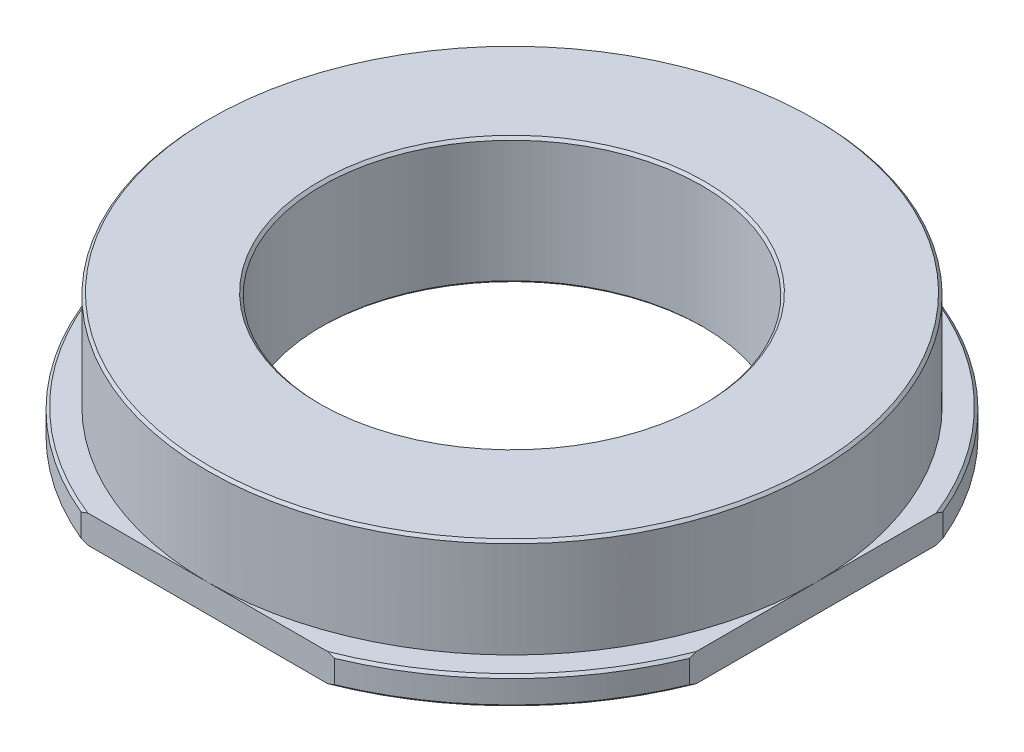
ISO-10303-21;
HEADER;
FILE_DESCRIPTION(('STEP AP214'),'2;1');
FILE_NAME('part.step','',(''),(''),'','','');
FILE_SCHEMA(('AUTOMOTIVE_DESIGN { 1 0 10303 214 1 1 1 1 }'));
ENDSEC;
DATA;
#1=APPLICATION_CONTEXT('core data for automotive mechanical design processes');
#2=APPLICATION_PROTOCOL_DEFINITION('international standard','automotive_design',2000,#1);
#3=PRODUCT_CONTEXT('',#1,'mechanical');
#4=PRODUCT('Part','Part','',(#3));
#5=PRODUCT_RELATED_PRODUCT_CATEGORY('part','',(#4));
#6=PRODUCT_DEFINITION_FORMATION('','',#4);
#7=PRODUCT_DEFINITION_CONTEXT('part definition',#1,'design');
#8=PRODUCT_DEFINITION('design','',#6,#7);
#9=PRODUCT_DEFINITION_SHAPE('','',#8);
#10=(LENGTH_UNIT() NAMED_UNIT(*) SI_UNIT(.MILLI.,.METRE.));
#11=(NAMED_UNIT(*) PLANE_ANGLE_UNIT() SI_UNIT($,.RADIAN.));
#12=(NAMED_UNIT(*) SI_UNIT($,.STERADIAN.) SOLID_ANGLE_UNIT());
#13=UNCERTAINTY_MEASURE_WITH_UNIT(LENGTH_MEASURE(1.E-05),#10,'distance_accuracy_value','');
#14=(GEOMETRIC_REPRESENTATION_CONTEXT(3) GLOBAL_UNCERTAINTY_ASSIGNED_CONTEXT((#13)) GLOBAL_UNIT_ASSIGNED_CONTEXT((#10,
#11,#12)) REPRESENTATION_CONTEXT('',''));
#15=CARTESIAN_POINT('',(0.,0.,0.));
#16=DIRECTION('',(0.,0.,1.));
#17=DIRECTION('',(1.,0.,0.));
#18=AXIS2_PLACEMENT_3D('',#15,#16,#17);
#19=CARTESIAN_POINT('',(0.,1.1,0.));
#20=DIRECTION('',(0.,-1.,0.));
#21=DIRECTION('',(0.,0.,-1.));
#22=AXIS2_PLACEMENT_3D('',#19,#20,#21);
#23=CYLINDRICAL_SURFACE('',#22,13.);
#24=CARTESIAN_POINT('',(0.,1.00000000000001,0.));
#25=DIRECTION('',(0.,1.,0.));
#26=DIRECTION('',(0.,0.,1.));
#27=AXIS2_PLACEMENT_3D('',#24,#25,#26);
#28=CIRCLE('',#27,13.);
#29=CARTESIAN_POINT('',(12.,1.00000000000001,5.));
#30=VERTEX_POINT('',#29);
#31=CARTESIAN_POINT('',(5.,1.00000000000001,12.));
#32=VERTEX_POINT('',#31);
#33=EDGE_CURVE('E302',#30,#32,#28,.F.);
#34=ORIENTED_EDGE('',*,*,#33,.T.);
#35=DIRECTION('',(0.,1.,0.));
#36=VECTOR('',#35,1.);
#37=CARTESIAN_POINT('',(5.,0.,12.));
#38=LINE('',#37,#36);
#39=CARTESIAN_POINT('',(5.,0.0999999999999973,12.));
#40=VERTEX_POINT('',#39);
#41=EDGE_CURVE('E444',#40,#32,#38,.T.);
#42=ORIENTED_EDGE('',*,*,#41,.F.);
#43=CARTESIAN_POINT('',(0.,0.0999999999999994,0.));
#44=DIRECTION('',(0.,1.,0.));
#45=DIRECTION('',(0.,0.,1.));
#46=AXIS2_PLACEMENT_3D('',#43,#44,#45);
#47=CIRCLE('',#46,13.);
#48=CARTESIAN_POINT('',(12.,0.0999999999999973,5.));
#49=VERTEX_POINT('',#48);
#50=EDGE_CURVE('E203',#40,#49,#47,.T.);
#51=ORIENTED_EDGE('',*,*,#50,.T.);
#52=DIRECTION('',(0.,1.,0.));
#53=VECTOR('',#52,1.);
#54=CARTESIAN_POINT('',(12.,0.,5.));
#55=LINE('',#54,#53);
#56=EDGE_CURVE('E193',#49,#30,#55,.T.);
#57=ORIENTED_EDGE('',*,*,#56,.T.);
#58=EDGE_LOOP('',(#34,#42,#51,#57));
#59=FACE_BOUND('',#58,.T.);
#60=ADVANCED_FACE('F41',(#59),#23,.T.);
#61=CARTESIAN_POINT('',(-12.,0.100000000000001,5.));
#62=VERTEX_POINT('',#61);
#63=CARTESIAN_POINT('',(-5.00000000000001,0.0999999999999994,12.));
#64=VERTEX_POINT('',#63);
#65=EDGE_CURVE('E317',#62,#64,#47,.T.);
#66=ORIENTED_EDGE('',*,*,#65,.T.);
#67=DIRECTION('',(0.,1.,0.));
#68=VECTOR('',#67,1.);
#69=CARTESIAN_POINT('',(-5.00000000000001,0.,12.));
#70=LINE('',#69,#68);
#71=CARTESIAN_POINT('',(-5.00000000000001,1.00000000000001,12.));
#72=VERTEX_POINT('',#71);
#73=EDGE_CURVE('E236',#64,#72,#70,.T.);
#74=ORIENTED_EDGE('',*,*,#73,.T.);
#75=CARTESIAN_POINT('',(-12.,1.,5.));
#76=VERTEX_POINT('',#75);
#77=EDGE_CURVE('E310',#72,#76,#28,.F.);
#78=ORIENTED_EDGE('',*,*,#77,.T.);
#79=DIRECTION('',(0.,1.,0.));
#80=VECTOR('',#79,1.);
#81=CARTESIAN_POINT('',(-12.,0.,5.));
#82=LINE('',#81,#80);
#83=EDGE_CURVE('E330',#62,#76,#82,.T.);
#84=ORIENTED_EDGE('',*,*,#83,.F.);
#85=EDGE_LOOP('',(#66,#74,#78,#84));
#86=FACE_BOUND('',#85,.T.);
#87=ADVANCED_FACE('F405',(#86),#23,.T.);
#88=CARTESIAN_POINT('',(5.,1.,-12.));
#89=VERTEX_POINT('',#88);
#90=CARTESIAN_POINT('',(12.,1.00000000000001,-5.00000000000001));
#91=VERTEX_POINT('',#90);
#92=EDGE_CURVE('E308',#89,#91,#28,.F.);
#93=ORIENTED_EDGE('',*,*,#92,.T.);
#94=DIRECTION('',(0.,1.,0.));
#95=VECTOR('',#94,1.);
#96=CARTESIAN_POINT('',(12.,0.,-5.00000000000001));
#97=LINE('',#96,#95);
#98=CARTESIAN_POINT('',(12.,0.0999999999999994,-5.00000000000001));
#99=VERTEX_POINT('',#98);
#100=EDGE_CURVE('E304',#99,#91,#97,.T.);
#101=ORIENTED_EDGE('',*,*,#100,.F.);
#102=CARTESIAN_POINT('',(5.,0.1,-12.));
#103=VERTEX_POINT('',#102);
#104=EDGE_CURVE('E450',#99,#103,#47,.T.);
#105=ORIENTED_EDGE('',*,*,#104,.T.);
#106=DIRECTION('',(0.,1.,0.));
#107=VECTOR('',#106,1.);
#108=CARTESIAN_POINT('',(5.,0.,-12.));
#109=LINE('',#108,#107);
#110=EDGE_CURVE('E347',#103,#89,#109,.T.);
#111=ORIENTED_EDGE('',*,*,#110,.T.);
#112=EDGE_LOOP('',(#93,#101,#105,#111));
#113=FACE_BOUND('',#112,.T.);
#114=ADVANCED_FACE('F411',(#113),#23,.T.);
#115=CARTESIAN_POINT('',(0.,1.1,0.));
#116=DIRECTION('',(0.,1.,0.));
#117=DIRECTION('',(0.,0.,1.));
#118=AXIS2_PLACEMENT_3D('',#115,#116,#117);
#119=PLANE('',#118);
#120=DIRECTION('',(-1.,0.,0.));
#121=VECTOR('',#120,1.);
#122=CARTESIAN_POINT('',(-5.00000000000001,1.1,12.));
#123=LINE('',#122,#121);
#124=CARTESIAN_POINT('',(4.73392015141787,1.1,12.));
#125=VERTEX_POINT('',#124);
#126=CARTESIAN_POINT('',(0.,1.1,12.));
#127=VERTEX_POINT('',#126);
#128=EDGE_CURVE('E440',#125,#127,#123,.T.);
#129=ORIENTED_EDGE('',*,*,#128,.F.);
#130=CARTESIAN_POINT('',(0.,1.1,0.));
#131=DIRECTION('',(0.,1.,0.));
#132=DIRECTION('',(0.,0.,1.));
#133=AXIS2_PLACEMENT_3D('',#130,#131,#132);
#134=CIRCLE('',#133,12.9);
#135=CARTESIAN_POINT('',(12.,1.1,4.73392015141787));
#136=VERTEX_POINT('',#135);
#137=EDGE_CURVE('E201',#125,#136,#134,.T.);
#138=ORIENTED_EDGE('',*,*,#137,.T.);
#139=DIRECTION('',(0.,0.,1.));
#140=VECTOR('',#139,1.);
#141=CARTESIAN_POINT('',(12.,1.1,-5.00000000000001));
#142=LINE('',#141,#140);
#143=CARTESIAN_POINT('',(12.,1.1,0.));
#144=VERTEX_POINT('',#143);
#145=EDGE_CURVE('E294',#144,#136,#142,.T.);
#146=ORIENTED_EDGE('',*,*,#145,.F.);
#147=CARTESIAN_POINT('',(0.,1.1,0.));
#148=DIRECTION('',(0.,1.,0.));
#149=DIRECTION('',(0.,0.,1.));
#150=AXIS2_PLACEMENT_3D('',#147,#148,#149);
#151=CIRCLE('',#150,12.);
#152=EDGE_CURVE('E368',#127,#144,#151,.T.);
#153=ORIENTED_EDGE('',*,*,#152,.F.);
#154=EDGE_LOOP('',(#129,#138,#146,#153));
#155=FACE_BOUND('',#154,.T.);
#156=ADVANCED_FACE('F420',(#155),#119,.T.);
#157=CARTESIAN_POINT('',(-4.73392015141787,1.1,12.));
#158=VERTEX_POINT('',#157);
#159=EDGE_CURVE('E63',#127,#158,#123,.T.);
#160=ORIENTED_EDGE('',*,*,#159,.F.);
#161=CARTESIAN_POINT('',(-12.,1.1,0.));
#162=VERTEX_POINT('',#161);
#163=EDGE_CURVE('E464',#162,#127,#151,.T.);
#164=ORIENTED_EDGE('',*,*,#163,.F.);
#165=DIRECTION('',(0.,0.,-1.));
#166=VECTOR('',#165,1.);
#167=CARTESIAN_POINT('',(-12.,1.1,-5.));
#168=LINE('',#167,#166);
#169=CARTESIAN_POINT('',(-12.,1.1,4.73392015141786));
#170=VERTEX_POINT('',#169);
#171=EDGE_CURVE('E339',#170,#162,#168,.T.);
#172=ORIENTED_EDGE('',*,*,#171,.F.);
#173=EDGE_CURVE('E198',#170,#158,#134,.T.);
#174=ORIENTED_EDGE('',*,*,#173,.T.);
#175=EDGE_LOOP('',(#160,#164,#172,#174));
#176=FACE_BOUND('',#175,.T.);
#177=ADVANCED_FACE('F429',(#176),#119,.T.);
#178=CARTESIAN_POINT('',(12.,1.1,-4.73392015141787));
#179=VERTEX_POINT('',#178);
#180=EDGE_CURVE('E331',#179,#144,#142,.T.);
#181=ORIENTED_EDGE('',*,*,#180,.F.);
#182=CARTESIAN_POINT('',(4.73392015141786,1.1,-12.));
#183=VERTEX_POINT('',#182);
#184=EDGE_CURVE('E197',#179,#183,#134,.T.);
#185=ORIENTED_EDGE('',*,*,#184,.T.);
#186=DIRECTION('',(1.,0.,0.));
#187=VECTOR('',#186,1.);
#188=CARTESIAN_POINT('',(-5.00000000000001,1.1,-12.));
#189=LINE('',#188,#187);
#190=CARTESIAN_POINT('',(0.,1.1,-12.));
#191=VERTEX_POINT('',#190);
#192=EDGE_CURVE('E194',#191,#183,#189,.T.);
#193=ORIENTED_EDGE('',*,*,#192,.F.);
#194=EDGE_CURVE('E436',#144,#191,#151,.T.);
#195=ORIENTED_EDGE('',*,*,#194,.F.);
#196=EDGE_LOOP('',(#181,#185,#193,#195));
#197=FACE_BOUND('',#196,.T.);
#198=ADVANCED_FACE('F421',(#197),#119,.T.);
#199=CARTESIAN_POINT('',(0.,0.0999999999999994,0.));
#200=DIRECTION('',(0.,1.,0.));
#201=DIRECTION('',(0.,0.,1.));
#202=AXIS2_PLACEMENT_3D('',#199,#200,#201);
#203=CONICAL_SURFACE('',#202,13.,0.78539816339744);
#204=CARTESIAN_POINT('',(-5.0007,0.100269246827158,12.));
#205=CARTESIAN_POINT('',(-4.80436559069171,0.0247512120051053,12.));
#206=CARTESIAN_POINT('',(-4.60676621718833,-0.0474713325769007,12.));
#207=CARTESIAN_POINT('',(-4.2089801621442,-0.184631135744701,12.));
#208=CARTESIAN_POINT('',(-4.00879257966631,-0.249565776923834,12.));
#209=CARTESIAN_POINT('',(-3.40349546924359,-0.432613485132128,12.));
#210=CARTESIAN_POINT('',(-2.99460545343862,-0.538596381616291,12.));
#211=CARTESIAN_POINT('',(-2.18373512558342,-0.709113139830806,12.));
#212=CARTESIAN_POINT('',(-1.7820501981881,-0.775022866066654,12.));
#213=CARTESIAN_POINT('',(-1.17647133145461,-0.844140361571116,12.));
#214=CARTESIAN_POINT('',(-0.974204670743062,-0.862220065519578,12.));
#215=CARTESIAN_POINT('',(-0.569026727711756,-0.888215216235631,12.));
#216=CARTESIAN_POINT('',(-0.366115521211545,-0.896131817139486,12.));
#217=CARTESIAN_POINT('',(0.0529209633131464,-0.90182828314445,12.));
#218=CARTESIAN_POINT('',(0.269055723663059,-0.898922545680876,12.));
#219=CARTESIAN_POINT('',(0.700857413054728,-0.881486877199495,12.));
#220=CARTESIAN_POINT('',(0.916524328851617,-0.866956621284406,12.));
#221=CARTESIAN_POINT('',(1.34710127665348,-0.826529720335928,12.));
#222=CARTESIAN_POINT('',(1.56200978061346,-0.800616812485354,12.));
#223=CARTESIAN_POINT('',(1.99024560334901,-0.737921601446699,12.));
#224=CARTESIAN_POINT('',(2.20357263972516,-0.701137402740791,12.));
#225=CARTESIAN_POINT('',(2.85758901197706,-0.572037682421292,12.));
#226=CARTESIAN_POINT('',(3.29501490079845,-0.462652404327219,12.));
#227=CARTESIAN_POINT('',(3.94190522254019,-0.270821544695109,12.));
#228=CARTESIAN_POINT('',(4.15572001826799,-0.202360132391963,12.));
#229=CARTESIAN_POINT('',(4.5803954983391,-0.0570894780124971,12.));
#230=CARTESIAN_POINT('',(4.79125744067843,0.0197160790366296,12.));
#231=CARTESIAN_POINT('',(5.0007,0.100269246827158,12.));
#232=B_SPLINE_CURVE_WITH_KNOTS('',3,(#204,#205,#206,#207,#208,#209,#210,#211,#212,#213,#214,
#215,#216,#217,#218,#219,#220,#221,#222,#223,#224,#225,#226,#227,#228,#229,#230,#231),
.UNSPECIFIED.,.F.,.F.,(4,2,2,2,2,2,2,2,2,2,2,2,2,4),(0.,0.631023505635001,1.26227291922842,
2.52783720141404,3.74705176700287,4.35605246577188,4.96498399944617,5.61312874722268,
6.26129161083119,6.91038355620533,7.55958874406138,8.90990793085279,9.58330665986992,
10.2564091953233),.UNSPECIFIED.);
#233=CARTESIAN_POINT('',(-4.73392015141786,0.,12.));
#234=VERTEX_POINT('',#233);
#235=EDGE_CURVE('E456',#64,#234,#232,.T.);
#236=ORIENTED_EDGE('',*,*,#235,.F.);
#237=ORIENTED_EDGE('',*,*,#65,.F.);
#238=CARTESIAN_POINT('',(-12.,0.100269246827161,-5.0007));
#239=CARTESIAN_POINT('',(-12.,0.0247512120051079,-4.80436559069171));
#240=CARTESIAN_POINT('',(-12.,-0.0474713325768985,-4.60676621718833));
#241=CARTESIAN_POINT('',(-12.,-0.184631135744699,-4.2089801621442));
#242=CARTESIAN_POINT('',(-12.,-0.249565776923832,-4.00879257966631));
#243=CARTESIAN_POINT('',(-12.,-0.432613485132127,-3.40349546924359));
#244=CARTESIAN_POINT('',(-12.,-0.538596381616289,-2.99460545343862));
#245=CARTESIAN_POINT('',(-12.,-0.709113139830804,-2.18373512558341));
#246=CARTESIAN_POINT('',(-12.,-0.775022866066654,-1.78205019818809));
#247=CARTESIAN_POINT('',(-12.,-0.844140361571114,-1.17647133145461));
#248=CARTESIAN_POINT('',(-12.,-0.862220065519575,-0.974204670743058));
#249=CARTESIAN_POINT('',(-12.,-0.888215216235627,-0.569026727711753));
#250=CARTESIAN_POINT('',(-12.,-0.896131817139483,-0.366115521211541));
#251=CARTESIAN_POINT('',(-12.,-0.901828283144447,0.0529209633131503));
#252=CARTESIAN_POINT('',(-12.,-0.898922545680873,0.269055723663063));
#253=CARTESIAN_POINT('',(-12.,-0.881486877199491,0.700857413054732));
#254=CARTESIAN_POINT('',(-12.,-0.866956621284403,0.916524328851621));
#255=CARTESIAN_POINT('',(-12.,-0.826529720335925,1.34710127665349));
#256=CARTESIAN_POINT('',(-12.,-0.800616812485351,1.56200978061346));
#257=CARTESIAN_POINT('',(-12.,-0.737921601446695,1.99024560334902));
#258=CARTESIAN_POINT('',(-12.,-0.701137402740788,2.20357263972516));
#259=CARTESIAN_POINT('',(-12.,-0.572037682421289,2.85758901197706));
#260=CARTESIAN_POINT('',(-12.,-0.462652404327216,3.29501490079846));
#261=CARTESIAN_POINT('',(-12.,-0.270821544695106,3.94190522254019));
#262=CARTESIAN_POINT('',(-12.,-0.202360132391959,4.15572001826799));
#263=CARTESIAN_POINT('',(-12.,-0.0570894780124934,4.58039549833911));
#264=CARTESIAN_POINT('',(-12.,0.0197160790366335,4.79125744067843));
#265=CARTESIAN_POINT('',(-12.,0.100269246827161,5.0007));
#266=B_SPLINE_CURVE_WITH_KNOTS('',3,(#238,#239,#240,#241,#242,#243,#244,#245,#246,#247,#248,
#249,#250,#251,#252,#253,#254,#255,#256,#257,#258,#259,#260,#261,#262,#263,#264,#265),
.UNSPECIFIED.,.F.,.F.,(4,2,2,2,2,2,2,2,2,2,2,2,2,4),(0.,0.631023505635003,1.26227291922842,
2.52783720141404,3.74705176700287,4.35605246577188,4.96498399944617,5.61312874722268,
6.26129161083119,6.91038355620533,7.55958874406138,8.90990793085279,9.58330665986992,
10.2564091953233),.UNSPECIFIED.);
#267=CARTESIAN_POINT('',(-12.,0.,4.73392015141785));
#268=VERTEX_POINT('',#267);
#269=EDGE_CURVE('E261',#268,#62,#266,.T.);
#270=ORIENTED_EDGE('',*,*,#269,.F.);
#271=CARTESIAN_POINT('',(0.,0.,0.));
#272=DIRECTION('',(0.,1.,0.));
#273=DIRECTION('',(0.,0.,1.));
#274=AXIS2_PLACEMENT_3D('',#271,#272,#273);
#275=CIRCLE('',#274,12.9);
#276=EDGE_CURVE('E367',#234,#268,#275,.F.);
#277=ORIENTED_EDGE('',*,*,#276,.F.);
#278=EDGE_LOOP('',(#236,#237,#270,#277));
#279=FACE_BOUND('',#278,.T.);
#280=ADVANCED_FACE('F254',(#279),#203,.T.);
#281=CARTESIAN_POINT('',(-12.,0.100000000000001,-5.));
#282=VERTEX_POINT('',#281);
#283=CARTESIAN_POINT('',(-12.,0.,-4.73392015141785));
#284=VERTEX_POINT('',#283);
#285=EDGE_CURVE('E266',#282,#284,#266,.T.);
#286=ORIENTED_EDGE('',*,*,#285,.F.);
#287=CARTESIAN_POINT('',(-5.00000000000001,0.100000000000001,-12.));
#288=VERTEX_POINT('',#287);
#289=EDGE_CURVE('E323',#288,#282,#47,.T.);
#290=ORIENTED_EDGE('',*,*,#289,.F.);
#291=CARTESIAN_POINT('',(5.0007,0.100269246827159,-12.));
#292=CARTESIAN_POINT('',(4.80436559069171,0.0247512120051077,-12.));
#293=CARTESIAN_POINT('',(4.60676621718833,-0.0474713325768985,-12.));
#294=CARTESIAN_POINT('',(4.2089801621442,-0.1846311357447,-12.));
#295=CARTESIAN_POINT('',(4.00879257966631,-0.249565776923833,-12.));
#296=CARTESIAN_POINT('',(3.40349546924359,-0.432613485132129,-12.));
#297=CARTESIAN_POINT('',(2.99460545343861,-0.53859638161629,-12.));
#298=CARTESIAN_POINT('',(2.18373512558341,-0.709113139830804,-12.));
#299=CARTESIAN_POINT('',(1.78205019818809,-0.775022866066653,-12.));
#300=CARTESIAN_POINT('',(1.17647133145461,-0.844140361571114,-12.));
#301=CARTESIAN_POINT('',(0.974204670743057,-0.862220065519575,-12.));
#302=CARTESIAN_POINT('',(0.569026727711752,-0.888215216235627,-12.));
#303=CARTESIAN_POINT('',(0.36611552121154,-0.896131817139482,-12.));
#304=CARTESIAN_POINT('',(-0.052920963313151,-0.901828283144446,-12.));
#305=CARTESIAN_POINT('',(-0.269055723663064,-0.898922545680873,-12.));
#306=CARTESIAN_POINT('',(-0.700857413054733,-0.881486877199491,-12.));
#307=CARTESIAN_POINT('',(-0.916524328851623,-0.866956621284403,-12.));
#308=CARTESIAN_POINT('',(-1.34710127665349,-0.826529720335925,-12.));
#309=CARTESIAN_POINT('',(-1.56200978061346,-0.800616812485351,-12.));
#310=CARTESIAN_POINT('',(-1.99024560334902,-0.737921601446695,-12.));
#311=CARTESIAN_POINT('',(-2.20357263972516,-0.701137402740786,-12.));
#312=CARTESIAN_POINT('',(-2.85758901197706,-0.572037682421286,-12.));
#313=CARTESIAN_POINT('',(-3.29501490079846,-0.462652404327214,-12.));
#314=CARTESIAN_POINT('',(-3.9419052225402,-0.270821544695104,-12.));
#315=CARTESIAN_POINT('',(-4.15572001826799,-0.202360132391958,-12.));
#316=CARTESIAN_POINT('',(-4.58039549833911,-0.0570894780124917,-12.));
#317=CARTESIAN_POINT('',(-4.79125744067843,0.0197160790366351,-12.));
#318=CARTESIAN_POINT('',(-5.00070000000001,0.100269246827163,-12.));
#319=B_SPLINE_CURVE_WITH_KNOTS('',3,(#291,#292,#293,#294,#295,#296,#297,#298,#299,#300,#301,
#302,#303,#304,#305,#306,#307,#308,#309,#310,#311,#312,#313,#314,#315,#316,#317,#318),
.UNSPECIFIED.,.F.,.F.,(4,2,2,2,2,2,2,2,2,2,2,2,2,4),(0.,0.631023505635002,1.26227291922842,
2.52783720141404,3.74705176700287,4.35605246577188,4.96498399944617,5.61312874722268,
6.26129161083119,6.91038355620533,7.55958874406138,8.90990793085279,9.58330665986992,
10.2564091953233),.UNSPECIFIED.);
#320=CARTESIAN_POINT('',(-4.73392015141785,0.,-12.));
#321=VERTEX_POINT('',#320);
#322=EDGE_CURVE('E228',#321,#288,#319,.T.);
#323=ORIENTED_EDGE('',*,*,#322,.F.);
#324=EDGE_CURVE('E359',#284,#321,#275,.F.);
#325=ORIENTED_EDGE('',*,*,#324,.F.);
#326=EDGE_LOOP('',(#286,#290,#323,#325));
#327=FACE_BOUND('',#326,.T.);
#328=ADVANCED_FACE('F560',(#327),#203,.T.);
#329=CARTESIAN_POINT('',(4.73392015141786,0.,12.));
#330=VERTEX_POINT('',#329);
#331=EDGE_CURVE('E268',#330,#40,#232,.T.);
#332=ORIENTED_EDGE('',*,*,#331,.F.);
#333=CARTESIAN_POINT('',(12.,0.,4.73392015141786));
#334=VERTEX_POINT('',#333);
#335=EDGE_CURVE('E365',#334,#330,#275,.F.);
#336=ORIENTED_EDGE('',*,*,#335,.F.);
#337=CARTESIAN_POINT('',(12.,0.100269246827158,5.0007));
#338=CARTESIAN_POINT('',(12.,0.024751212005105,4.8043655906917));
#339=CARTESIAN_POINT('',(12.,-0.0474713325769017,4.60676621718833));
#340=CARTESIAN_POINT('',(12.,-0.184631135744704,4.2089801621442));
#341=CARTESIAN_POINT('',(12.,-0.249565776923837,4.00879257966631));
#342=CARTESIAN_POINT('',(12.,-0.432613485132132,3.40349546924359));
#343=CARTESIAN_POINT('',(12.,-0.538596381616293,2.99460545343861));
#344=CARTESIAN_POINT('',(12.,-0.709113139830807,2.18373512558341));
#345=CARTESIAN_POINT('',(12.,-0.775022866066657,1.78205019818809));
#346=CARTESIAN_POINT('',(12.,-0.844140361571117,1.17647133145461));
#347=CARTESIAN_POINT('',(12.,-0.862220065519578,0.974204670743057));
#348=CARTESIAN_POINT('',(12.,-0.88821521623563,0.569026727711752));
#349=CARTESIAN_POINT('',(12.,-0.896131817139486,0.36611552121154));
#350=CARTESIAN_POINT('',(12.,-0.90182828314445,-0.0529209633131512));
#351=CARTESIAN_POINT('',(12.,-0.898922545680876,-0.269055723663064));
#352=CARTESIAN_POINT('',(12.,-0.881486877199495,-0.700857413054733));
#353=CARTESIAN_POINT('',(12.,-0.866956621284406,-0.916524328851622));
#354=CARTESIAN_POINT('',(12.,-0.826529720335928,-1.34710127665349));
#355=CARTESIAN_POINT('',(12.,-0.800616812485354,-1.56200978061346));
#356=CARTESIAN_POINT('',(12.,-0.737921601446698,-1.99024560334902));
#357=CARTESIAN_POINT('',(12.,-0.70113740274079,-2.20357263972516));
#358=CARTESIAN_POINT('',(12.,-0.572037682421289,-2.85758901197707));
#359=CARTESIAN_POINT('',(12.,-0.462652404327216,-3.29501490079846));
#360=CARTESIAN_POINT('',(12.,-0.270821544695106,-3.9419052225402));
#361=CARTESIAN_POINT('',(12.,-0.20236013239196,-4.15572001826799));
#362=CARTESIAN_POINT('',(12.,-0.0570894780124955,-4.58039549833911));
#363=CARTESIAN_POINT('',(12.,0.0197160790366312,-4.79125744067843));
#364=CARTESIAN_POINT('',(12.,0.100269246827159,-5.00070000000001));
#365=B_SPLINE_CURVE_WITH_KNOTS('',3,(#337,#338,#339,#340,#341,#342,#343,#344,#345,#346,#347,
#348,#349,#350,#351,#352,#353,#354,#355,#356,#357,#358,#359,#360,#361,#362,#363,#364),
.UNSPECIFIED.,.F.,.F.,(4,2,2,2,2,2,2,2,2,2,2,2,2,4),(0.,0.631023505635003,1.26227291922842,
2.52783720141404,3.74705176700287,4.35605246577188,4.96498399944617,5.61312874722268,
6.26129161083119,6.91038355620533,7.55958874406138,8.90990793085279,9.58330665986993,
10.2564091953233),.UNSPECIFIED.);
#366=EDGE_CURVE('E267',#49,#334,#365,.T.);
#367=ORIENTED_EDGE('',*,*,#366,.F.);
#368=ORIENTED_EDGE('',*,*,#50,.F.);
#369=EDGE_LOOP('',(#332,#336,#367,#368));
#370=FACE_BOUND('',#369,.T.);
#371=ADVANCED_FACE('F255',(#370),#203,.T.);
#372=CARTESIAN_POINT('',(0.,1.1,0.));
#373=DIRECTION('',(0.,-1.,0.));
#374=DIRECTION('',(0.,0.,-1.));
#375=AXIS2_PLACEMENT_3D('',#372,#373,#374);
#376=CONICAL_SURFACE('',#375,12.9,0.78539816339744);
#377=CARTESIAN_POINT('',(5.0007,0.999730753172848,12.));
#378=CARTESIAN_POINT('',(4.80436559069171,1.0752487879949,12.));
#379=CARTESIAN_POINT('',(4.60676621718833,1.14747133257691,12.));
#380=CARTESIAN_POINT('',(4.2089801621442,1.28463113574471,12.));
#381=CARTESIAN_POINT('',(4.00879257966631,1.34956577692384,12.));
#382=CARTESIAN_POINT('',(3.40349546924359,1.53261348513214,12.));
#383=CARTESIAN_POINT('',(2.99460545343861,1.6385963816163,12.));
#384=CARTESIAN_POINT('',(2.18373512558341,1.80911313983081,12.));
#385=CARTESIAN_POINT('',(1.78205019818809,1.87502286606666,12.));
#386=CARTESIAN_POINT('',(1.17647133145461,1.94414036157112,12.));
#387=CARTESIAN_POINT('',(0.974204670743058,1.96222006551958,12.));
#388=CARTESIAN_POINT('',(0.569026727711753,1.98821521623564,12.));
#389=CARTESIAN_POINT('',(0.366115521211541,1.99613181713949,12.));
#390=CARTESIAN_POINT('',(-0.0529209633131494,2.00182828314446,12.));
#391=CARTESIAN_POINT('',(-0.269055723663062,1.99892254568088,12.));
#392=CARTESIAN_POINT('',(-0.700857413054732,1.9814868771995,12.));
#393=CARTESIAN_POINT('',(-0.916524328851621,1.96695662128441,12.));
#394=CARTESIAN_POINT('',(-1.34710127665349,1.92652972033593,12.));
#395=CARTESIAN_POINT('',(-1.56200978061346,1.90061681248536,12.));
#396=CARTESIAN_POINT('',(-1.99024560334902,1.8379216014467,12.));
#397=CARTESIAN_POINT('',(-2.20357263972516,1.8011374027408,12.));
#398=CARTESIAN_POINT('',(-2.85758901197706,1.6720376824213,12.));
#399=CARTESIAN_POINT('',(-3.29501490079846,1.56265240432722,12.));
#400=CARTESIAN_POINT('',(-3.94190522254019,1.37082154469511,12.));
#401=CARTESIAN_POINT('',(-4.15572001826799,1.30236013239197,12.));
#402=CARTESIAN_POINT('',(-4.58039549833911,1.1570894780125,12.));
#403=CARTESIAN_POINT('',(-4.79125744067843,1.08028392096337,12.));
#404=CARTESIAN_POINT('',(-5.00070000000001,0.999730753172846,12.));
#405=B_SPLINE_CURVE_WITH_KNOTS('',3,(#377,#378,#379,#380,#381,#382,#383,#384,#385,#386,#387,
#388,#389,#390,#391,#392,#393,#394,#395,#396,#397,#398,#399,#400,#401,#402,#403,#404),
.UNSPECIFIED.,.F.,.F.,(4,2,2,2,2,2,2,2,2,2,2,2,2,4),(0.,0.631023505635002,1.26227291922842,
2.52783720141404,3.74705176700287,4.35605246577188,4.96498399944617,5.61312874722268,
6.26129161083119,6.91038355620533,7.55958874406138,8.90990793085279,9.58330665986992,
10.2564091953233),.UNSPECIFIED.);
#406=EDGE_CURVE('E11',#32,#125,#405,.T.);
#407=ORIENTED_EDGE('',*,*,#406,.F.);
#408=ORIENTED_EDGE('',*,*,#33,.F.);
#409=CARTESIAN_POINT('',(12.,0.999730753172846,-5.00070000000001));
#410=CARTESIAN_POINT('',(12.,1.0752487879949,-4.80436559069171));
#411=CARTESIAN_POINT('',(12.,1.14747133257691,-4.60676621718833));
#412=CARTESIAN_POINT('',(12.,1.28463113574471,-4.2089801621442));
#413=CARTESIAN_POINT('',(12.,1.34956577692384,-4.00879257966631));
#414=CARTESIAN_POINT('',(12.,1.53261348513213,-3.40349546924359));
#415=CARTESIAN_POINT('',(12.,1.6385963816163,-2.99460545343862));
#416=CARTESIAN_POINT('',(12.,1.80911313983081,-2.18373512558342));
#417=CARTESIAN_POINT('',(12.,1.87502286606666,-1.7820501981881));
#418=CARTESIAN_POINT('',(12.,1.94414036157112,-1.17647133145461));
#419=CARTESIAN_POINT('',(12.,1.96222006551958,-0.97420467074306));
#420=CARTESIAN_POINT('',(12.,1.98821521623564,-0.569026727711754));
#421=CARTESIAN_POINT('',(12.,1.99613181713949,-0.366115521211543));
#422=CARTESIAN_POINT('',(12.,2.00182828314446,0.0529209633131481));
#423=CARTESIAN_POINT('',(12.,1.99892254568088,0.26905572366306));
#424=CARTESIAN_POINT('',(12.,1.9814868771995,0.70085741305473));
#425=CARTESIAN_POINT('',(12.,1.96695662128441,0.916524328851618));
#426=CARTESIAN_POINT('',(12.,1.92652972033593,1.34710127665348));
#427=CARTESIAN_POINT('',(12.,1.90061681248536,1.56200978061346));
#428=CARTESIAN_POINT('',(12.,1.8379216014467,1.99024560334902));
#429=CARTESIAN_POINT('',(12.,1.8011374027408,2.20357263972516));
#430=CARTESIAN_POINT('',(12.,1.6720376824213,2.85758901197706));
#431=CARTESIAN_POINT('',(12.,1.56265240432722,3.29501490079846));
#432=CARTESIAN_POINT('',(12.,1.37082154469511,3.94190522254019));
#433=CARTESIAN_POINT('',(12.,1.30236013239197,4.15572001826799));
#434=CARTESIAN_POINT('',(12.,1.1570894780125,4.5803954983391));
#435=CARTESIAN_POINT('',(12.,1.08028392096338,4.79125744067843));
#436=CARTESIAN_POINT('',(12.,0.999730753172848,5.0007));
#437=B_SPLINE_CURVE_WITH_KNOTS('',3,(#409,#410,#411,#412,#413,#414,#415,#416,#417,#418,#419,
#420,#421,#422,#423,#424,#425,#426,#427,#428,#429,#430,#431,#432,#433,#434,#435,#436),
.UNSPECIFIED.,.F.,.F.,(4,2,2,2,2,2,2,2,2,2,2,2,2,4),(0.,0.631023505635003,1.26227291922842,
2.52783720141404,3.74705176700287,4.35605246577188,4.96498399944617,5.61312874722268,
6.26129161083119,6.91038355620533,7.55958874406139,8.90990793085279,9.58330665986992,
10.2564091953233),.UNSPECIFIED.);
#438=EDGE_CURVE('E182',#136,#30,#437,.T.);
#439=ORIENTED_EDGE('',*,*,#438,.F.);
#440=ORIENTED_EDGE('',*,*,#137,.F.);
#441=EDGE_LOOP('',(#407,#408,#439,#440));
#442=FACE_BOUND('',#441,.T.);
#443=ADVANCED_FACE('F307',(#442),#376,.T.);
#444=EDGE_CURVE('E47',#158,#72,#405,.T.);
#445=ORIENTED_EDGE('',*,*,#444,.F.);
#446=ORIENTED_EDGE('',*,*,#173,.F.);
#447=CARTESIAN_POINT('',(-12.,0.999730753172846,5.0007));
#448=CARTESIAN_POINT('',(-12.,1.0752487879949,4.80436559069171));
#449=CARTESIAN_POINT('',(-12.,1.1474713325769,4.60676621718833));
#450=CARTESIAN_POINT('',(-12.,1.2846311357447,4.2089801621442));
#451=CARTESIAN_POINT('',(-12.,1.34956577692384,4.00879257966631));
#452=CARTESIAN_POINT('',(-12.,1.53261348513213,3.40349546924359));
#453=CARTESIAN_POINT('',(-12.,1.63859638161629,2.99460545343861));
#454=CARTESIAN_POINT('',(-12.,1.80911313983081,2.18373512558341));
#455=CARTESIAN_POINT('',(-12.,1.87502286606666,1.78205019818809));
#456=CARTESIAN_POINT('',(-12.,1.94414036157112,1.17647133145461));
#457=CARTESIAN_POINT('',(-12.,1.96222006551958,0.974204670743058));
#458=CARTESIAN_POINT('',(-12.,1.98821521623563,0.569026727711753));
#459=CARTESIAN_POINT('',(-12.,1.99613181713949,0.366115521211541));
#460=CARTESIAN_POINT('',(-12.,2.00182828314445,-0.0529209633131503));
#461=CARTESIAN_POINT('',(-12.,1.99892254568088,-0.269055723663063));
#462=CARTESIAN_POINT('',(-12.,1.9814868771995,-0.700857413054732));
#463=CARTESIAN_POINT('',(-12.,1.96695662128441,-0.916524328851621));
#464=CARTESIAN_POINT('',(-12.,1.92652972033593,-1.34710127665349));
#465=CARTESIAN_POINT('',(-12.,1.90061681248536,-1.56200978061346));
#466=CARTESIAN_POINT('',(-12.,1.8379216014467,-1.99024560334902));
#467=CARTESIAN_POINT('',(-12.,1.80113740274079,-2.20357263972516));
#468=CARTESIAN_POINT('',(-12.,1.67203768242129,-2.85758901197706));
#469=CARTESIAN_POINT('',(-12.,1.56265240432722,-3.29501490079846));
#470=CARTESIAN_POINT('',(-12.,1.37082154469511,-3.94190522254019));
#471=CARTESIAN_POINT('',(-12.,1.30236013239196,-4.15572001826799));
#472=CARTESIAN_POINT('',(-12.,1.1570894780125,-4.58039549833911));
#473=CARTESIAN_POINT('',(-12.,1.08028392096337,-4.79125744067843));
#474=CARTESIAN_POINT('',(-12.,0.999730753172844,-5.0007));
#475=B_SPLINE_CURVE_WITH_KNOTS('',3,(#447,#448,#449,#450,#451,#452,#453,#454,#455,#456,#457,
#458,#459,#460,#461,#462,#463,#464,#465,#466,#467,#468,#469,#470,#471,#472,#473,#474),
.UNSPECIFIED.,.F.,.F.,(4,2,2,2,2,2,2,2,2,2,2,2,2,4),(0.,0.631023505635002,1.26227291922842,
2.52783720141404,3.74705176700287,4.35605246577188,4.96498399944617,5.61312874722268,
6.26129161083119,6.91038355620533,7.55958874406138,8.90990793085279,9.58330665986992,
10.2564091953233),.UNSPECIFIED.);
#476=EDGE_CURVE('E284',#76,#170,#475,.T.);
#477=ORIENTED_EDGE('',*,*,#476,.F.);
#478=ORIENTED_EDGE('',*,*,#77,.F.);
#479=EDGE_LOOP('',(#445,#446,#477,#478));
#480=FACE_BOUND('',#479,.T.);
#481=ADVANCED_FACE('F422',(#480),#376,.T.);
#482=EDGE_CURVE('E285',#91,#179,#437,.T.);
#483=ORIENTED_EDGE('',*,*,#482,.F.);
#484=ORIENTED_EDGE('',*,*,#92,.F.);
#485=CARTESIAN_POINT('',(-5.0007,0.999730753172844,-12.));
#486=CARTESIAN_POINT('',(-4.80436559069171,1.0752487879949,-12.));
#487=CARTESIAN_POINT('',(-4.60676621718833,1.1474713325769,-12.));
#488=CARTESIAN_POINT('',(-4.2089801621442,1.2846311357447,-12.));
#489=CARTESIAN_POINT('',(-4.00879257966631,1.34956577692384,-12.));
#490=CARTESIAN_POINT('',(-3.40349546924359,1.53261348513213,-12.));
#491=CARTESIAN_POINT('',(-2.99460545343862,1.63859638161629,-12.));
#492=CARTESIAN_POINT('',(-2.18373512558342,1.80911313983081,-12.));
#493=CARTESIAN_POINT('',(-1.7820501981881,1.87502286606666,-12.));
#494=CARTESIAN_POINT('',(-1.17647133145461,1.94414036157112,-12.));
#495=CARTESIAN_POINT('',(-0.97420467074306,1.96222006551958,-12.));
#496=CARTESIAN_POINT('',(-0.569026727711754,1.98821521623563,-12.));
#497=CARTESIAN_POINT('',(-0.366115521211543,1.99613181713949,-12.));
#498=CARTESIAN_POINT('',(0.0529209633131483,2.00182828314445,-12.));
#499=CARTESIAN_POINT('',(0.269055723663061,1.99892254568088,-12.));
#500=CARTESIAN_POINT('',(0.70085741305473,1.9814868771995,-12.));
#501=CARTESIAN_POINT('',(0.916524328851619,1.96695662128441,-12.));
#502=CARTESIAN_POINT('',(1.34710127665348,1.92652972033593,-12.));
#503=CARTESIAN_POINT('',(1.56200978061346,1.90061681248536,-12.));
#504=CARTESIAN_POINT('',(1.99024560334902,1.8379216014467,-12.));
#505=CARTESIAN_POINT('',(2.20357263972516,1.80113740274079,-12.));
#506=CARTESIAN_POINT('',(2.85758901197706,1.67203768242129,-12.));
#507=CARTESIAN_POINT('',(3.29501490079846,1.56265240432722,-12.));
#508=CARTESIAN_POINT('',(3.94190522254019,1.37082154469511,-12.));
#509=CARTESIAN_POINT('',(4.15572001826799,1.30236013239196,-12.));
#510=CARTESIAN_POINT('',(4.5803954983391,1.1570894780125,-12.));
#511=CARTESIAN_POINT('',(4.79125744067843,1.08028392096337,-12.));
#512=CARTESIAN_POINT('',(5.0007,0.999730753172846,-12.));
#513=B_SPLINE_CURVE_WITH_KNOTS('',3,(#485,#486,#487,#488,#489,#490,#491,#492,#493,#494,#495,
#496,#497,#498,#499,#500,#501,#502,#503,#504,#505,#506,#507,#508,#509,#510,#511,#512),
.UNSPECIFIED.,.F.,.F.,(4,2,2,2,2,2,2,2,2,2,2,2,2,4),(0.,0.631023505635003,1.26227291922842,
2.52783720141404,3.74705176700287,4.35605246577188,4.96498399944617,5.61312874722268,
6.26129161083119,6.91038355620533,7.55958874406138,8.90990793085279,9.58330665986992,
10.2564091953233),.UNSPECIFIED.);
#514=EDGE_CURVE('E183',#183,#89,#513,.T.);
#515=ORIENTED_EDGE('',*,*,#514,.F.);
#516=ORIENTED_EDGE('',*,*,#184,.F.);
#517=EDGE_LOOP('',(#483,#484,#515,#516));
#518=FACE_BOUND('',#517,.T.);
#519=ADVANCED_FACE('F414',(#518),#376,.T.);
#520=ORIENTED_EDGE('',*,*,#289,.T.);
#521=DIRECTION('',(0.,1.,0.));
#522=VECTOR('',#521,1.);
#523=CARTESIAN_POINT('',(-12.,0.,-5.));
#524=LINE('',#523,#522);
#525=CARTESIAN_POINT('',(-12.,1.,-5.));
#526=VERTEX_POINT('',#525);
#527=EDGE_CURVE('E328',#282,#526,#524,.T.);
#528=ORIENTED_EDGE('',*,*,#527,.T.);
#529=CARTESIAN_POINT('',(-5.00000000000001,1.,-12.));
#530=VERTEX_POINT('',#529);
#531=EDGE_CURVE('E312',#526,#530,#28,.F.);
#532=ORIENTED_EDGE('',*,*,#531,.T.);
#533=DIRECTION('',(0.,1.,0.));
#534=VECTOR('',#533,1.);
#535=CARTESIAN_POINT('',(-5.00000000000001,0.,-12.));
#536=LINE('',#535,#534);
#537=EDGE_CURVE('E177',#288,#530,#536,.T.);
#538=ORIENTED_EDGE('',*,*,#537,.F.);
#539=EDGE_LOOP('',(#520,#528,#532,#538));
#540=FACE_BOUND('',#539,.T.);
#541=ADVANCED_FACE('F326',(#540),#23,.T.);
#542=CARTESIAN_POINT('',(-12.,1.1,-4.73392015141786));
#543=VERTEX_POINT('',#542);
#544=EDGE_CURVE('E71',#162,#543,#168,.T.);
#545=ORIENTED_EDGE('',*,*,#544,.F.);
#546=EDGE_CURVE('E191',#191,#162,#151,.T.);
#547=ORIENTED_EDGE('',*,*,#546,.F.);
#548=CARTESIAN_POINT('',(-4.73392015141786,1.1,-12.));
#549=VERTEX_POINT('',#548);
#550=EDGE_CURVE('E174',#549,#191,#189,.T.);
#551=ORIENTED_EDGE('',*,*,#550,.F.);
#552=EDGE_CURVE('E189',#549,#543,#134,.T.);
#553=ORIENTED_EDGE('',*,*,#552,.T.);
#554=EDGE_LOOP('',(#545,#547,#551,#553));
#555=FACE_BOUND('',#554,.T.);
#556=ADVANCED_FACE('F188',(#555),#119,.T.);
#557=CARTESIAN_POINT('',(0.,0.,0.));
#558=DIRECTION('',(0.,1.,0.));
#559=DIRECTION('',(0.,0.,1.));
#560=AXIS2_PLACEMENT_3D('',#557,#558,#559);
#561=PLANE('',#560);
#562=CARTESIAN_POINT('',(0.,0.,0.));
#563=DIRECTION('',(0.,1.,0.));
#564=DIRECTION('',(0.,0.,1.));
#565=AXIS2_PLACEMENT_3D('',#562,#563,#564);
#566=CIRCLE('',#565,7.6);
#567=CARTESIAN_POINT('',(0.,0.,7.6));
#568=VERTEX_POINT('',#567);
#569=EDGE_CURVE('E371',#568,#568,#566,.T.);
#570=ORIENTED_EDGE('',*,*,#569,.T.);
#571=EDGE_LOOP('',(#570));
#572=FACE_BOUND('',#571,.T.);
#573=ORIENTED_EDGE('',*,*,#335,.T.);
#574=DIRECTION('',(-1.,0.,0.));
#575=VECTOR('',#574,1.);
#576=CARTESIAN_POINT('',(-5.00000000000001,0.,12.));
#577=LINE('',#576,#575);
#578=EDGE_CURVE('E441',#330,#234,#577,.T.);
#579=ORIENTED_EDGE('',*,*,#578,.T.);
#580=ORIENTED_EDGE('',*,*,#276,.T.);
#581=DIRECTION('',(0.,0.,-1.));
#582=VECTOR('',#581,1.);
#583=CARTESIAN_POINT('',(-12.,0.,-5.));
#584=LINE('',#583,#582);
#585=EDGE_CURVE('E333',#268,#284,#584,.T.);
#586=ORIENTED_EDGE('',*,*,#585,.T.);
#587=ORIENTED_EDGE('',*,*,#324,.T.);
#588=DIRECTION('',(1.,0.,0.));
#589=VECTOR('',#588,1.);
#590=CARTESIAN_POINT('',(-5.00000000000001,0.,-12.));
#591=LINE('',#590,#589);
#592=CARTESIAN_POINT('',(4.73392015141785,0.,-12.));
#593=VERTEX_POINT('',#592);
#594=EDGE_CURVE('E237',#321,#593,#591,.T.);
#595=ORIENTED_EDGE('',*,*,#594,.T.);
#596=CARTESIAN_POINT('',(12.,0.,-4.73392015141786));
#597=VERTEX_POINT('',#596);
#598=EDGE_CURVE('E357',#593,#597,#275,.F.);
#599=ORIENTED_EDGE('',*,*,#598,.T.);
#600=DIRECTION('',(0.,0.,1.));
#601=VECTOR('',#600,1.);
#602=CARTESIAN_POINT('',(12.,0.,-5.00000000000001));
#603=LINE('',#602,#601);
#604=EDGE_CURVE('E342',#597,#334,#603,.T.);
#605=ORIENTED_EDGE('',*,*,#604,.T.);
#606=EDGE_LOOP('',(#573,#579,#580,#586,#587,#595,#599,#605));
#607=FACE_BOUND('',#606,.T.);
#608=ADVANCED_FACE('F356',(#572,#607),#561,.F.);
#609=CARTESIAN_POINT('',(0.,5.,0.));
#610=DIRECTION('',(0.,-1.,0.));
#611=DIRECTION('',(0.,0.,-1.));
#612=AXIS2_PLACEMENT_3D('',#609,#610,#611);
#613=CYLINDRICAL_SURFACE('',#612,12.);
#614=CARTESIAN_POINT('',(0.,4.9,0.));
#615=DIRECTION('',(0.,1.,0.));
#616=DIRECTION('',(0.,0.,1.));
#617=AXIS2_PLACEMENT_3D('',#614,#615,#616);
#618=CIRCLE('',#617,12.);
#619=CARTESIAN_POINT('',(0.,4.9,12.));
#620=VERTEX_POINT('',#619);
#621=EDGE_CURVE('E309',#620,#620,#618,.F.);
#622=ORIENTED_EDGE('',*,*,#621,.T.);
#623=EDGE_LOOP('',(#622));
#624=FACE_BOUND('',#623,.T.);
#625=ORIENTED_EDGE('',*,*,#152,.T.);
#626=ORIENTED_EDGE('',*,*,#194,.T.);
#627=ORIENTED_EDGE('',*,*,#546,.T.);
#628=ORIENTED_EDGE('',*,*,#163,.T.);
#629=EDGE_LOOP('',(#625,#626,#627,#628));
#630=FACE_BOUND('',#629,.T.);
#631=ADVANCED_FACE('F403',(#624,#630),#613,.T.);
#632=CARTESIAN_POINT('',(0.,5.,0.));
#633=DIRECTION('',(0.,1.,0.));
#634=DIRECTION('',(0.,0.,1.));
#635=AXIS2_PLACEMENT_3D('',#632,#633,#634);
#636=PLANE('',#635);
#637=CARTESIAN_POINT('',(0.,5.,0.));
#638=DIRECTION('',(0.,1.,0.));
#639=DIRECTION('',(0.,0.,1.));
#640=AXIS2_PLACEMENT_3D('',#637,#638,#639);
#641=CIRCLE('',#640,7.6);
#642=CARTESIAN_POINT('',(0.,5.,7.6));
#643=VERTEX_POINT('',#642);
#644=EDGE_CURVE('E314',#643,#643,#641,.F.);
#645=ORIENTED_EDGE('',*,*,#644,.T.);
#646=EDGE_LOOP('',(#645));
#647=FACE_BOUND('',#646,.T.);
#648=CARTESIAN_POINT('',(0.,5.,0.));
#649=DIRECTION('',(0.,1.,0.));
#650=DIRECTION('',(0.,0.,1.));
#651=AXIS2_PLACEMENT_3D('',#648,#649,#650);
#652=CIRCLE('',#651,11.9);
#653=CARTESIAN_POINT('',(0.,5.,11.9));
#654=VERTEX_POINT('',#653);
#655=EDGE_CURVE('E380',#654,#654,#652,.T.);
#656=ORIENTED_EDGE('',*,*,#655,.T.);
#657=EDGE_LOOP('',(#656));
#658=FACE_BOUND('',#657,.T.);
#659=ADVANCED_FACE('F386',(#647,#658),#636,.T.);
#660=CARTESIAN_POINT('',(0.,0.,0.));
#661=DIRECTION('',(0.,1.,0.));
#662=DIRECTION('',(0.,0.,1.));
#663=AXIS2_PLACEMENT_3D('',#660,#661,#662);
#664=CYLINDRICAL_SURFACE('',#663,7.5);
#665=CARTESIAN_POINT('',(0.,0.100000000000002,0.));
#666=DIRECTION('',(0.,1.,0.));
#667=DIRECTION('',(0.,0.,1.));
#668=AXIS2_PLACEMENT_3D('',#665,#666,#667);
#669=CIRCLE('',#668,7.5);
#670=CARTESIAN_POINT('',(0.,0.100000000000002,7.5));
#671=VERTEX_POINT('',#670);
#672=EDGE_CURVE('E377',#671,#671,#669,.F.);
#673=ORIENTED_EDGE('',*,*,#672,.T.);
#674=EDGE_LOOP('',(#673));
#675=FACE_BOUND('',#674,.T.);
#676=CARTESIAN_POINT('',(0.,4.9,0.));
#677=DIRECTION('',(0.,1.,0.));
#678=DIRECTION('',(0.,0.,1.));
#679=AXIS2_PLACEMENT_3D('',#676,#677,#678);
#680=CIRCLE('',#679,7.5);
#681=CARTESIAN_POINT('',(0.,4.9,7.5));
#682=VERTEX_POINT('',#681);
#683=EDGE_CURVE('E374',#682,#682,#680,.T.);
#684=ORIENTED_EDGE('',*,*,#683,.T.);
#685=EDGE_LOOP('',(#684));
#686=FACE_BOUND('',#685,.T.);
#687=ADVANCED_FACE('F224',(#675,#686),#664,.F.);
#688=CARTESIAN_POINT('',(0.,0.,0.));
#689=DIRECTION('',(0.,-1.,0.));
#690=DIRECTION('',(0.,0.,-1.));
#691=AXIS2_PLACEMENT_3D('',#688,#689,#690);
#692=CONICAL_SURFACE('',#691,7.6,0.785398163397457);
#693=ORIENTED_EDGE('',*,*,#672,.F.);
#694=EDGE_LOOP('',(#693));
#695=FACE_BOUND('',#694,.T.);
#696=ORIENTED_EDGE('',*,*,#569,.F.);
#697=EDGE_LOOP('',(#696));
#698=FACE_BOUND('',#697,.T.);
#699=ADVANCED_FACE('F392',(#695,#698),#692,.F.);
#700=CARTESIAN_POINT('',(0.,4.9,0.));
#701=DIRECTION('',(0.,1.,0.));
#702=DIRECTION('',(0.,0.,1.));
#703=AXIS2_PLACEMENT_3D('',#700,#701,#702);
#704=CONICAL_SURFACE('',#703,7.5,0.785398163397435);
#705=ORIENTED_EDGE('',*,*,#644,.F.);
#706=EDGE_LOOP('',(#705));
#707=FACE_BOUND('',#706,.T.);
#708=ORIENTED_EDGE('',*,*,#683,.F.);
#709=EDGE_LOOP('',(#708));
#710=FACE_BOUND('',#709,.T.);
#711=ADVANCED_FACE('F389',(#707,#710),#704,.F.);
#712=CARTESIAN_POINT('',(0.,5.,0.));
#713=DIRECTION('',(0.,-1.,0.));
#714=DIRECTION('',(0.,0.,-1.));
#715=AXIS2_PLACEMENT_3D('',#712,#713,#714);
#716=CONICAL_SURFACE('',#715,11.9,0.785398163397457);
#717=ORIENTED_EDGE('',*,*,#621,.F.);
#718=EDGE_LOOP('',(#717));
#719=FACE_BOUND('',#718,.T.);
#720=ORIENTED_EDGE('',*,*,#655,.F.);
#721=EDGE_LOOP('',(#720));
#722=FACE_BOUND('',#721,.T.);
#723=ADVANCED_FACE('F252',(#719,#722),#716,.T.);
#724=EDGE_CURVE('E238',#597,#99,#365,.T.);
#725=ORIENTED_EDGE('',*,*,#724,.F.);
#726=ORIENTED_EDGE('',*,*,#598,.F.);
#727=EDGE_CURVE('E235',#103,#593,#319,.T.);
#728=ORIENTED_EDGE('',*,*,#727,.F.);
#729=ORIENTED_EDGE('',*,*,#104,.F.);
#730=EDGE_LOOP('',(#725,#726,#728,#729));
#731=FACE_BOUND('',#730,.T.);
#732=ADVANCED_FACE('F245',(#731),#203,.T.);
#733=EDGE_CURVE('E196',#543,#526,#475,.T.);
#734=ORIENTED_EDGE('',*,*,#733,.F.);
#735=ORIENTED_EDGE('',*,*,#552,.F.);
#736=EDGE_CURVE('E171',#530,#549,#513,.T.);
#737=ORIENTED_EDGE('',*,*,#736,.F.);
#738=ORIENTED_EDGE('',*,*,#531,.F.);
#739=EDGE_LOOP('',(#734,#735,#737,#738));
#740=FACE_BOUND('',#739,.T.);
#741=ADVANCED_FACE('F44',(#740),#376,.T.);
#742=CARTESIAN_POINT('',(-5.00000000000001,0.,-12.));
#743=DIRECTION('',(0.,0.,1.));
#744=DIRECTION('',(1.,0.,0.));
#745=AXIS2_PLACEMENT_3D('',#742,#743,#744);
#746=PLANE('',#745);
#747=ORIENTED_EDGE('',*,*,#727,.T.);
#748=ORIENTED_EDGE('',*,*,#594,.F.);
#749=ORIENTED_EDGE('',*,*,#322,.T.);
#750=ORIENTED_EDGE('',*,*,#537,.T.);
#751=ORIENTED_EDGE('',*,*,#736,.T.);
#752=ORIENTED_EDGE('',*,*,#550,.T.);
#753=ORIENTED_EDGE('',*,*,#192,.T.);
#754=ORIENTED_EDGE('',*,*,#514,.T.);
#755=ORIENTED_EDGE('',*,*,#110,.F.);
#756=EDGE_LOOP('',(#747,#748,#749,#750,#751,#752,#753,#754,#755));
#757=FACE_BOUND('',#756,.T.);
#758=ADVANCED_FACE('F173',(#757),#746,.F.);
#759=CARTESIAN_POINT('',(12.,0.,-5.00000000000001));
#760=DIRECTION('',(-1.,0.,0.));
#761=DIRECTION('',(0.,0.,1.));
#762=AXIS2_PLACEMENT_3D('',#759,#760,#761);
#763=PLANE('',#762);
#764=ORIENTED_EDGE('',*,*,#366,.T.);
#765=ORIENTED_EDGE('',*,*,#604,.F.);
#766=ORIENTED_EDGE('',*,*,#724,.T.);
#767=ORIENTED_EDGE('',*,*,#100,.T.);
#768=ORIENTED_EDGE('',*,*,#482,.T.);
#769=ORIENTED_EDGE('',*,*,#180,.T.);
#770=ORIENTED_EDGE('',*,*,#145,.T.);
#771=ORIENTED_EDGE('',*,*,#438,.T.);
#772=ORIENTED_EDGE('',*,*,#56,.F.);
#773=EDGE_LOOP('',(#764,#765,#766,#767,#768,#769,#770,#771,#772));
#774=FACE_BOUND('',#773,.T.);
#775=ADVANCED_FACE('F221',(#774),#763,.F.);
#776=CARTESIAN_POINT('',(-12.,0.,-5.));
#777=DIRECTION('',(1.,0.,0.));
#778=DIRECTION('',(0.,0.,-1.));
#779=AXIS2_PLACEMENT_3D('',#776,#777,#778);
#780=PLANE('',#779);
#781=ORIENTED_EDGE('',*,*,#285,.T.);
#782=ORIENTED_EDGE('',*,*,#585,.F.);
#783=ORIENTED_EDGE('',*,*,#269,.T.);
#784=ORIENTED_EDGE('',*,*,#83,.T.);
#785=ORIENTED_EDGE('',*,*,#476,.T.);
#786=ORIENTED_EDGE('',*,*,#171,.T.);
#787=ORIENTED_EDGE('',*,*,#544,.T.);
#788=ORIENTED_EDGE('',*,*,#733,.T.);
#789=ORIENTED_EDGE('',*,*,#527,.F.);
#790=EDGE_LOOP('',(#781,#782,#783,#784,#785,#786,#787,#788,#789));
#791=FACE_BOUND('',#790,.T.);
#792=ADVANCED_FACE('F274',(#791),#780,.F.);
#793=CARTESIAN_POINT('',(-5.00000000000001,0.,12.));
#794=DIRECTION('',(0.,0.,-1.));
#795=DIRECTION('',(-1.,0.,0.));
#796=AXIS2_PLACEMENT_3D('',#793,#794,#795);
#797=PLANE('',#796);
#798=ORIENTED_EDGE('',*,*,#235,.T.);
#799=ORIENTED_EDGE('',*,*,#578,.F.);
#800=ORIENTED_EDGE('',*,*,#331,.T.);
#801=ORIENTED_EDGE('',*,*,#41,.T.);
#802=ORIENTED_EDGE('',*,*,#406,.T.);
#803=ORIENTED_EDGE('',*,*,#128,.T.);
#804=ORIENTED_EDGE('',*,*,#159,.T.);
#805=ORIENTED_EDGE('',*,*,#444,.T.);
#806=ORIENTED_EDGE('',*,*,#73,.F.);
#807=EDGE_LOOP('',(#798,#799,#800,#801,#802,#803,#804,#805,#806));
#808=FACE_BOUND('',#807,.T.);
#809=ADVANCED_FACE('F277',(#808),#797,.F.);
#810=CLOSED_SHELL('',(#60,#87,#114,#156,#177,#198,#280,#328,#371,#443,#481,#519,#541,#556,#608,
#631,#659,#687,#699,#711,#723,#732,#741,#758,#775,#792,#809));
#811=MANIFOLD_SOLID_BREP('B2',#810);
#812=ADVANCED_BREP_SHAPE_REPRESENTATION('',(#18,#811),#14);
#813=SHAPE_DEFINITION_REPRESENTATION(#9,#812);
ENDSEC;
END-ISO-10303-21;
